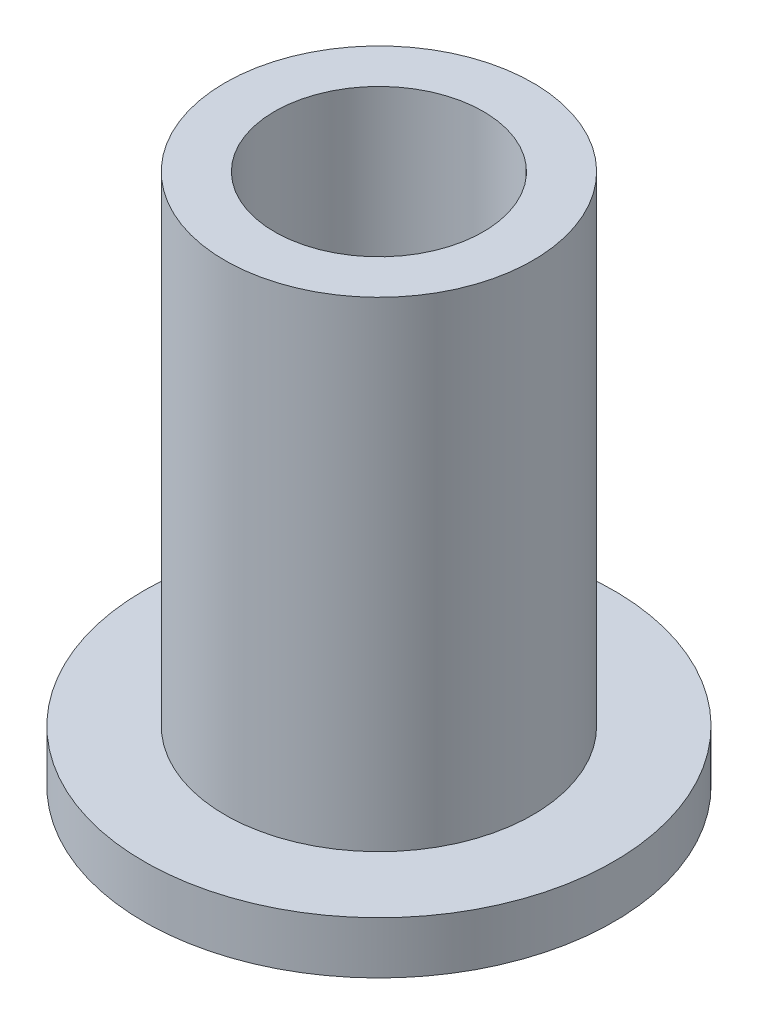
ISO-10303-21;
HEADER;
FILE_DESCRIPTION(('STEP AP214'),'2;1');
FILE_NAME('part.step','',(''),(''),'','','');
FILE_SCHEMA(('AUTOMOTIVE_DESIGN { 1 0 10303 214 1 1 1 1 }'));
ENDSEC;
DATA;
#1=APPLICATION_CONTEXT('core data for automotive mechanical design processes');
#2=APPLICATION_PROTOCOL_DEFINITION('international standard','automotive_design',2000,#1);
#3=PRODUCT_CONTEXT('',#1,'mechanical');
#4=PRODUCT('Part','Part','',(#3));
#5=PRODUCT_RELATED_PRODUCT_CATEGORY('part','',(#4));
#6=PRODUCT_DEFINITION_FORMATION('','',#4);
#7=PRODUCT_DEFINITION_CONTEXT('part definition',#1,'design');
#8=PRODUCT_DEFINITION('design','',#6,#7);
#9=PRODUCT_DEFINITION_SHAPE('','',#8);
#10=(LENGTH_UNIT() NAMED_UNIT(*) SI_UNIT(.MILLI.,.METRE.));
#11=(NAMED_UNIT(*) PLANE_ANGLE_UNIT() SI_UNIT($,.RADIAN.));
#12=(NAMED_UNIT(*) SI_UNIT($,.STERADIAN.) SOLID_ANGLE_UNIT());
#13=UNCERTAINTY_MEASURE_WITH_UNIT(LENGTH_MEASURE(1.E-05),#10,'distance_accuracy_value','');
#14=(GEOMETRIC_REPRESENTATION_CONTEXT(3) GLOBAL_UNCERTAINTY_ASSIGNED_CONTEXT((#13)) GLOBAL_UNIT_ASSIGNED_CONTEXT((#10,
#11,#12)) REPRESENTATION_CONTEXT('',''));
#15=CARTESIAN_POINT('',(0.,0.,0.));
#16=DIRECTION('',(0.,0.,1.));
#17=DIRECTION('',(1.,0.,0.));
#18=AXIS2_PLACEMENT_3D('',#15,#16,#17);
#19=CARTESIAN_POINT('',(0.,9.88587074578271,0.));
#20=DIRECTION('',(0.,1.,0.));
#21=DIRECTION('',(-1.,0.,0.));
#22=AXIS2_PLACEMENT_3D('',#19,#20,#21);
#23=CYLINDRICAL_SURFACE('',#22,4.5);
#24=CARTESIAN_POINT('',(0.,-4.7,0.));
#25=DIRECTION('',(0.,1.,0.));
#26=DIRECTION('',(-1.,0.,0.));
#27=AXIS2_PLACEMENT_3D('',#24,#25,#26);
#28=CIRCLE('',#27,4.5);
#29=CARTESIAN_POINT('',(-4.5,-4.7,0.));
#30=VERTEX_POINT('',#29);
#31=EDGE_CURVE('E70',#30,#30,#28,.T.);
#32=ORIENTED_EDGE('',*,*,#31,.T.);
#33=EDGE_LOOP('',(#32));
#34=FACE_BOUND('',#33,.T.);
#35=CARTESIAN_POINT('',(0.,-3.7,0.));
#36=DIRECTION('',(0.,1.,0.));
#37=DIRECTION('',(-1.,0.,0.));
#38=AXIS2_PLACEMENT_3D('',#35,#36,#37);
#39=CIRCLE('',#38,4.5);
#40=CARTESIAN_POINT('',(-4.5,-3.7,0.));
#41=VERTEX_POINT('',#40);
#42=EDGE_CURVE('E10',#41,#41,#39,.T.);
#43=ORIENTED_EDGE('',*,*,#42,.F.);
#44=EDGE_LOOP('',(#43));
#45=FACE_BOUND('',#44,.T.);
#46=ADVANCED_FACE('F43',(#34,#45),#23,.T.);
#47=CARTESIAN_POINT('',(-4.5,-3.7,0.));
#48=DIRECTION('',(0.,1.,0.));
#49=DIRECTION('',(-1.,0.,0.));
#50=AXIS2_PLACEMENT_3D('',#47,#48,#49);
#51=PLANE('',#50);
#52=ORIENTED_EDGE('',*,*,#42,.T.);
#53=EDGE_LOOP('',(#52));
#54=FACE_BOUND('',#53,.T.);
#55=CARTESIAN_POINT('',(0.,-3.7,0.));
#56=DIRECTION('',(0.,1.,0.));
#57=DIRECTION('',(-1.,0.,0.));
#58=AXIS2_PLACEMENT_3D('',#55,#56,#57);
#59=CIRCLE('',#58,2.95);
#60=CARTESIAN_POINT('',(-2.95,-3.7,0.));
#61=VERTEX_POINT('',#60);
#62=EDGE_CURVE('E50',#61,#61,#59,.T.);
#63=ORIENTED_EDGE('',*,*,#62,.F.);
#64=EDGE_LOOP('',(#63));
#65=FACE_BOUND('',#64,.T.);
#66=ADVANCED_FACE('F89',(#54,#65),#51,.T.);
#67=CARTESIAN_POINT('',(0.,9.88587074578271,0.));
#68=DIRECTION('',(0.,1.,0.));
#69=DIRECTION('',(-1.,0.,0.));
#70=AXIS2_PLACEMENT_3D('',#67,#68,#69);
#71=CYLINDRICAL_SURFACE('',#70,2.95);
#72=ORIENTED_EDGE('',*,*,#62,.T.);
#73=EDGE_LOOP('',(#72));
#74=FACE_BOUND('',#73,.T.);
#75=CARTESIAN_POINT('',(0.,5.5,0.));
#76=DIRECTION('',(0.,1.,0.));
#77=DIRECTION('',(-1.,0.,0.));
#78=AXIS2_PLACEMENT_3D('',#75,#76,#77);
#79=CIRCLE('',#78,2.95);
#80=CARTESIAN_POINT('',(-2.95,5.5,0.));
#81=VERTEX_POINT('',#80);
#82=EDGE_CURVE('E55',#81,#81,#79,.T.);
#83=ORIENTED_EDGE('',*,*,#82,.F.);
#84=EDGE_LOOP('',(#83));
#85=FACE_BOUND('',#84,.T.);
#86=ADVANCED_FACE('F93',(#74,#85),#71,.T.);
#87=CARTESIAN_POINT('',(-2.95,5.5,0.));
#88=DIRECTION('',(0.,1.,0.));
#89=DIRECTION('',(-1.,0.,0.));
#90=AXIS2_PLACEMENT_3D('',#87,#88,#89);
#91=PLANE('',#90);
#92=ORIENTED_EDGE('',*,*,#82,.T.);
#93=EDGE_LOOP('',(#92));
#94=FACE_BOUND('',#93,.T.);
#95=CARTESIAN_POINT('',(0.,5.5,0.));
#96=DIRECTION('',(0.,1.,0.));
#97=DIRECTION('',(-1.,0.,0.));
#98=AXIS2_PLACEMENT_3D('',#95,#96,#97);
#99=CIRCLE('',#98,2.);
#100=CARTESIAN_POINT('',(-2.,5.5,0.));
#101=VERTEX_POINT('',#100);
#102=EDGE_CURVE('E60',#101,#101,#99,.T.);
#103=ORIENTED_EDGE('',*,*,#102,.F.);
#104=EDGE_LOOP('',(#103));
#105=FACE_BOUND('',#104,.T.);
#106=ADVANCED_FACE('F85',(#94,#105),#91,.T.);
#107=CARTESIAN_POINT('',(0.,9.88587074578271,0.));
#108=DIRECTION('',(0.,1.,0.));
#109=DIRECTION('',(-1.,0.,0.));
#110=AXIS2_PLACEMENT_3D('',#107,#108,#109);
#111=CYLINDRICAL_SURFACE('',#110,2.);
#112=ORIENTED_EDGE('',*,*,#102,.T.);
#113=EDGE_LOOP('',(#112));
#114=FACE_BOUND('',#113,.T.);
#115=CARTESIAN_POINT('',(0.,-4.7,0.));
#116=DIRECTION('',(0.,1.,0.));
#117=DIRECTION('',(-1.,0.,0.));
#118=AXIS2_PLACEMENT_3D('',#115,#116,#117);
#119=CIRCLE('',#118,2.);
#120=CARTESIAN_POINT('',(-2.,-4.7,0.));
#121=VERTEX_POINT('',#120);
#122=EDGE_CURVE('E66',#121,#121,#119,.T.);
#123=ORIENTED_EDGE('',*,*,#122,.F.);
#124=EDGE_LOOP('',(#123));
#125=FACE_BOUND('',#124,.T.);
#126=ADVANCED_FACE('F79',(#114,#125),#111,.F.);
#127=CARTESIAN_POINT('',(-2.,-4.7,0.));
#128=DIRECTION('',(0.,-1.,0.));
#129=DIRECTION('',(1.,0.,0.));
#130=AXIS2_PLACEMENT_3D('',#127,#128,#129);
#131=PLANE('',#130);
#132=ORIENTED_EDGE('',*,*,#122,.T.);
#133=EDGE_LOOP('',(#132));
#134=FACE_BOUND('',#133,.T.);
#135=ORIENTED_EDGE('',*,*,#31,.F.);
#136=EDGE_LOOP('',(#135));
#137=FACE_BOUND('',#136,.T.);
#138=ADVANCED_FACE('F77',(#134,#137),#131,.T.);
#139=CLOSED_SHELL('',(#46,#66,#86,#106,#126,#138));
#140=MANIFOLD_SOLID_BREP('B2',#139);
#141=ADVANCED_BREP_SHAPE_REPRESENTATION('',(#18,#140),#14);
#142=SHAPE_DEFINITION_REPRESENTATION(#9,#141);
ENDSEC;
END-ISO-10303-21;
